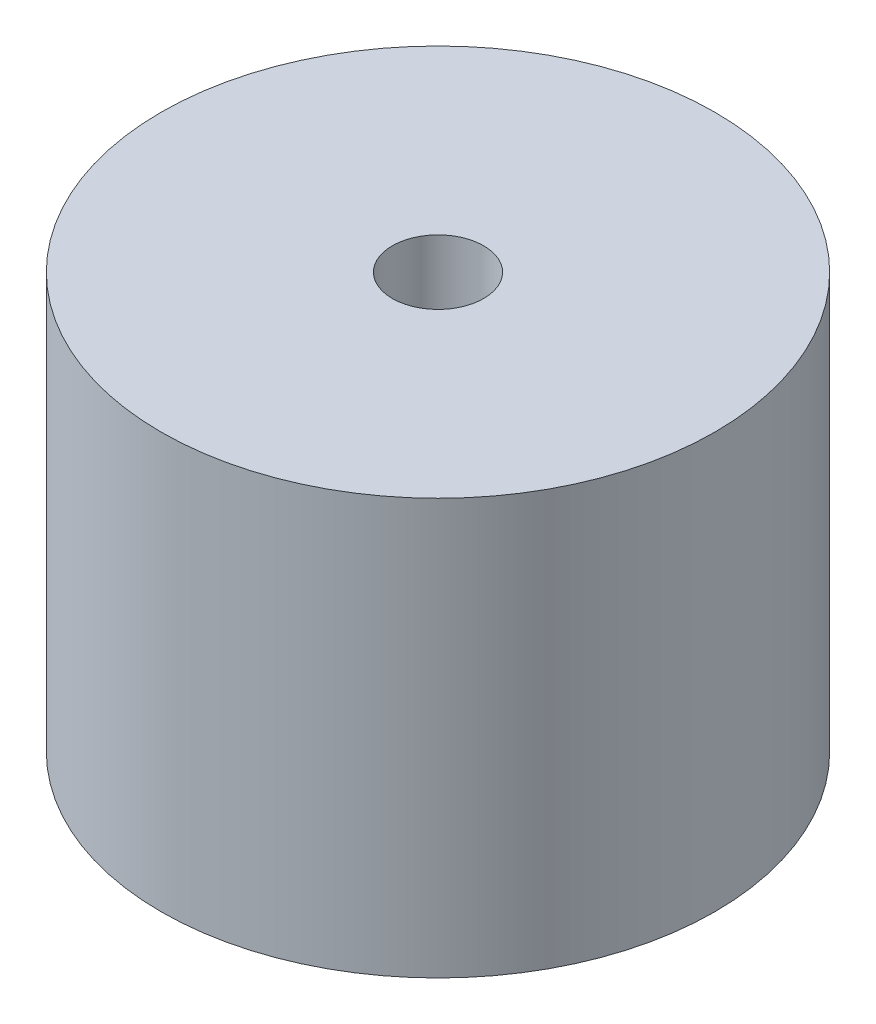
ISO-10303-21;
HEADER;
FILE_DESCRIPTION(('STEP AP214'),'2;1');
FILE_NAME('part.step','',(''),(''),'','','');
FILE_SCHEMA(('AUTOMOTIVE_DESIGN { 1 0 10303 214 1 1 1 1 }'));
ENDSEC;
DATA;
#1=APPLICATION_CONTEXT('core data for automotive mechanical design processes');
#2=APPLICATION_PROTOCOL_DEFINITION('international standard','automotive_design',2000,#1);
#3=PRODUCT_CONTEXT('',#1,'mechanical');
#4=PRODUCT('Part','Part','',(#3));
#5=PRODUCT_RELATED_PRODUCT_CATEGORY('part','',(#4));
#6=PRODUCT_DEFINITION_FORMATION('','',#4);
#7=PRODUCT_DEFINITION_CONTEXT('part definition',#1,'design');
#8=PRODUCT_DEFINITION('design','',#6,#7);
#9=PRODUCT_DEFINITION_SHAPE('','',#8);
#10=(LENGTH_UNIT() NAMED_UNIT(*) SI_UNIT(.MILLI.,.METRE.));
#11=(NAMED_UNIT(*) PLANE_ANGLE_UNIT() SI_UNIT($,.RADIAN.));
#12=(NAMED_UNIT(*) SI_UNIT($,.STERADIAN.) SOLID_ANGLE_UNIT());
#13=UNCERTAINTY_MEASURE_WITH_UNIT(LENGTH_MEASURE(1.E-05),#10,'distance_accuracy_value','');
#14=(GEOMETRIC_REPRESENTATION_CONTEXT(3) GLOBAL_UNCERTAINTY_ASSIGNED_CONTEXT((#13)) GLOBAL_UNIT_ASSIGNED_CONTEXT((#10,
#11,#12)) REPRESENTATION_CONTEXT('',''));
#15=CARTESIAN_POINT('',(0.,0.,0.));
#16=DIRECTION('',(0.,0.,1.));
#17=DIRECTION('',(1.,0.,0.));
#18=AXIS2_PLACEMENT_3D('',#15,#16,#17);
#19=CARTESIAN_POINT('',(0.,15.,0.));
#20=DIRECTION('',(0.,-1.,0.));
#21=DIRECTION('',(0.,0.,-1.));
#22=AXIS2_PLACEMENT_3D('',#19,#20,#21);
#23=CYLINDRICAL_SURFACE('',#22,10.);
#24=CARTESIAN_POINT('',(0.,15.,0.));
#25=DIRECTION('',(0.,1.,0.));
#26=DIRECTION('',(0.,0.,1.));
#27=AXIS2_PLACEMENT_3D('',#24,#25,#26);
#28=CIRCLE('',#27,10.);
#29=CARTESIAN_POINT('',(0.,15.,10.));
#30=VERTEX_POINT('',#29);
#31=EDGE_CURVE('E11',#30,#30,#28,.T.);
#32=ORIENTED_EDGE('',*,*,#31,.F.);
#33=EDGE_LOOP('',(#32));
#34=FACE_BOUND('',#33,.T.);
#35=CARTESIAN_POINT('',(0.,0.,0.));
#36=DIRECTION('',(0.,1.,0.));
#37=DIRECTION('',(0.,0.,1.));
#38=AXIS2_PLACEMENT_3D('',#35,#36,#37);
#39=CIRCLE('',#38,10.);
#40=CARTESIAN_POINT('',(0.,0.,10.));
#41=VERTEX_POINT('',#40);
#42=EDGE_CURVE('E47',#41,#41,#39,.T.);
#43=ORIENTED_EDGE('',*,*,#42,.T.);
#44=EDGE_LOOP('',(#43));
#45=FACE_BOUND('',#44,.T.);
#46=ADVANCED_FACE('F44',(#34,#45),#23,.T.);
#47=CARTESIAN_POINT('',(0.,15.,0.));
#48=DIRECTION('',(0.,1.,0.));
#49=DIRECTION('',(0.,0.,1.));
#50=AXIS2_PLACEMENT_3D('',#47,#48,#49);
#51=PLANE('',#50);
#52=CARTESIAN_POINT('',(0.,15.,0.));
#53=DIRECTION('',(0.,1.,0.));
#54=DIRECTION('',(0.,0.,1.));
#55=AXIS2_PLACEMENT_3D('',#52,#53,#54);
#56=CIRCLE('',#55,1.64999999999999);
#57=CARTESIAN_POINT('',(0.,15.,1.64999999999999));
#58=VERTEX_POINT('',#57);
#59=EDGE_CURVE('E65',#58,#58,#56,.T.);
#60=ORIENTED_EDGE('',*,*,#59,.F.);
#61=EDGE_LOOP('',(#60));
#62=FACE_BOUND('',#61,.T.);
#63=ORIENTED_EDGE('',*,*,#31,.T.);
#64=EDGE_LOOP('',(#63));
#65=FACE_BOUND('',#64,.T.);
#66=ADVANCED_FACE('F75',(#62,#65),#51,.T.);
#67=CARTESIAN_POINT('',(0.,0.,0.));
#68=DIRECTION('',(0.,1.,0.));
#69=DIRECTION('',(0.,0.,1.));
#70=AXIS2_PLACEMENT_3D('',#67,#68,#69);
#71=PLANE('',#70);
#72=ORIENTED_EDGE('',*,*,#42,.F.);
#73=EDGE_LOOP('',(#72));
#74=FACE_BOUND('',#73,.T.);
#75=ADVANCED_FACE('F58',(#74),#71,.F.);
#76=CARTESIAN_POINT('',(0.,10.,0.));
#77=DIRECTION('',(0.,1.,0.));
#78=DIRECTION('',(0.,0.,1.));
#79=AXIS2_PLACEMENT_3D('',#76,#77,#78);
#80=CONICAL_SURFACE('',#79,1.65,1.02974425867665);
#81=CARTESIAN_POINT('',(0.,9.00857997860452,0.));
#82=VERTEX_POINT('',#81);
#83=VERTEX_LOOP('',#82);
#84=FACE_BOUND('',#83,.T.);
#85=CARTESIAN_POINT('',(0.,10.,0.));
#86=DIRECTION('',(0.,1.,0.));
#87=DIRECTION('',(0.,0.,1.));
#88=AXIS2_PLACEMENT_3D('',#85,#86,#87);
#89=CIRCLE('',#88,1.65);
#90=CARTESIAN_POINT('',(0.,10.,1.65));
#91=VERTEX_POINT('',#90);
#92=EDGE_CURVE('E62',#91,#91,#89,.T.);
#93=ORIENTED_EDGE('',*,*,#92,.T.);
#94=EDGE_LOOP('',(#93));
#95=FACE_BOUND('',#94,.T.);
#96=ADVANCED_FACE('F54',(#84,#95),#80,.F.);
#97=CARTESIAN_POINT('',(0.,15.,0.));
#98=DIRECTION('',(0.,1.,0.));
#99=DIRECTION('',(0.,0.,1.));
#100=AXIS2_PLACEMENT_3D('',#97,#98,#99);
#101=CYLINDRICAL_SURFACE('',#100,1.64999999999999);
#102=ORIENTED_EDGE('',*,*,#92,.F.);
#103=EDGE_LOOP('',(#102));
#104=FACE_BOUND('',#103,.T.);
#105=ORIENTED_EDGE('',*,*,#59,.T.);
#106=EDGE_LOOP('',(#105));
#107=FACE_BOUND('',#106,.T.);
#108=ADVANCED_FACE('F57',(#104,#107),#101,.F.);
#109=CLOSED_SHELL('',(#46,#66,#75,#96,#108));
#110=MANIFOLD_SOLID_BREP('B2',#109);
#111=ADVANCED_BREP_SHAPE_REPRESENTATION('',(#18,#110),#14);
#112=SHAPE_DEFINITION_REPRESENTATION(#9,#111);
ENDSEC;
END-ISO-10303-21;
